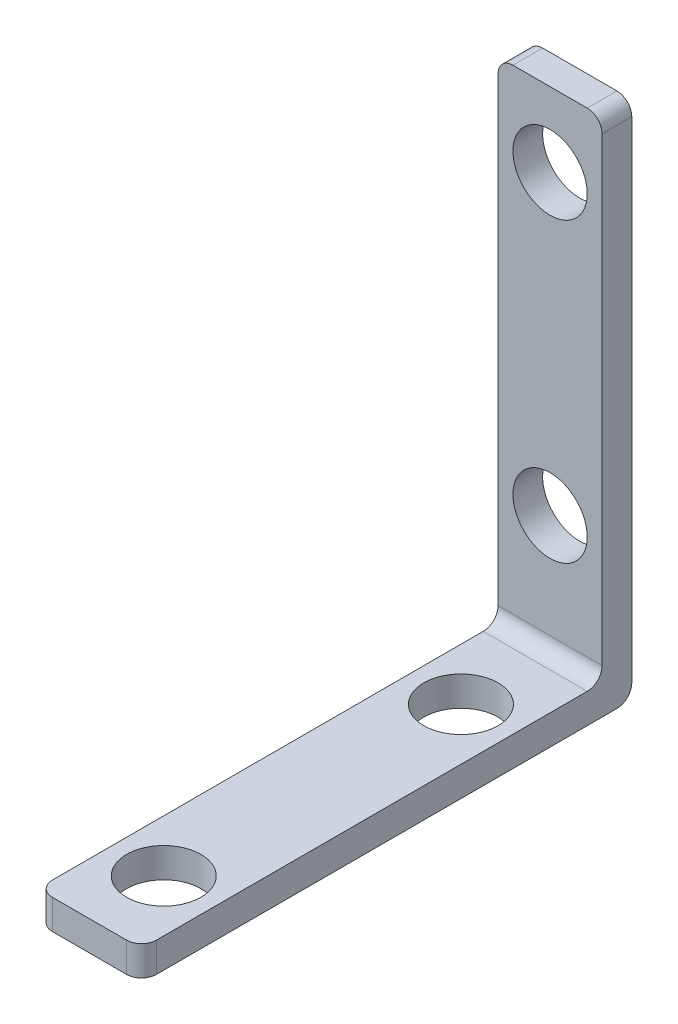
ISO-10303-21;
HEADER;
FILE_DESCRIPTION(('STEP AP214'),'2;1');
FILE_NAME('part.step','',(''),(''),'','','');
FILE_SCHEMA(('AUTOMOTIVE_DESIGN { 1 0 10303 214 1 1 1 1 }'));
ENDSEC;
DATA;
#1=APPLICATION_CONTEXT('core data for automotive mechanical design processes');
#2=APPLICATION_PROTOCOL_DEFINITION('international standard','automotive_design',2000,#1);
#3=PRODUCT_CONTEXT('',#1,'mechanical');
#4=PRODUCT('Part','Part','',(#3));
#5=PRODUCT_RELATED_PRODUCT_CATEGORY('part','',(#4));
#6=PRODUCT_DEFINITION_FORMATION('','',#4);
#7=PRODUCT_DEFINITION_CONTEXT('part definition',#1,'design');
#8=PRODUCT_DEFINITION('design','',#6,#7);
#9=PRODUCT_DEFINITION_SHAPE('','',#8);
#10=(LENGTH_UNIT() NAMED_UNIT(*) SI_UNIT(.MILLI.,.METRE.));
#11=(NAMED_UNIT(*) PLANE_ANGLE_UNIT() SI_UNIT($,.RADIAN.));
#12=(NAMED_UNIT(*) SI_UNIT($,.STERADIAN.) SOLID_ANGLE_UNIT());
#13=UNCERTAINTY_MEASURE_WITH_UNIT(LENGTH_MEASURE(1.E-05),#10,'distance_accuracy_value','');
#14=(GEOMETRIC_REPRESENTATION_CONTEXT(3) GLOBAL_UNCERTAINTY_ASSIGNED_CONTEXT((#13)) GLOBAL_UNIT_ASSIGNED_CONTEXT((#10,
#11,#12)) REPRESENTATION_CONTEXT('',''));
#15=CARTESIAN_POINT('',(0.,0.,0.));
#16=DIRECTION('',(0.,0.,1.));
#17=DIRECTION('',(1.,0.,0.));
#18=AXIS2_PLACEMENT_3D('',#15,#16,#17);
#19=CARTESIAN_POINT('',(7.,0.,2.));
#20=DIRECTION('',(-1.,0.,0.));
#21=DIRECTION('',(0.,0.,1.));
#22=AXIS2_PLACEMENT_3D('',#19,#20,#21);
#23=PLANE('',#22);
#24=DIRECTION('',(0.,1.,0.));
#25=VECTOR('',#24,1.);
#26=CARTESIAN_POINT('',(7.,0.,0.));
#27=LINE('',#26,#25);
#28=CARTESIAN_POINT('',(7.,1.,0.));
#29=VERTEX_POINT('',#28);
#30=CARTESIAN_POINT('',(7.,34.,0.));
#31=VERTEX_POINT('',#30);
#32=EDGE_CURVE('E146',#29,#31,#27,.T.);
#33=ORIENTED_EDGE('',*,*,#32,.T.);
#34=DIRECTION('',(0.,0.,-1.));
#35=VECTOR('',#34,1.);
#36=CARTESIAN_POINT('',(7.,34.,2.));
#37=LINE('',#36,#35);
#38=CARTESIAN_POINT('',(7.,34.,2.));
#39=VERTEX_POINT('',#38);
#40=EDGE_CURVE('E167',#31,#39,#37,.F.);
#41=ORIENTED_EDGE('',*,*,#40,.T.);
#42=DIRECTION('',(0.,1.,0.));
#43=VECTOR('',#42,1.);
#44=CARTESIAN_POINT('',(7.,0.,2.));
#45=LINE('',#44,#43);
#46=CARTESIAN_POINT('',(7.,3.,2.));
#47=VERTEX_POINT('',#46);
#48=EDGE_CURVE('E215',#47,#39,#45,.T.);
#49=ORIENTED_EDGE('',*,*,#48,.F.);
#50=CARTESIAN_POINT('',(7.,3.,3.));
#51=DIRECTION('',(-1.,0.,0.));
#52=DIRECTION('',(0.,0.,1.));
#53=AXIS2_PLACEMENT_3D('',#50,#51,#52);
#54=CIRCLE('',#53,1.);
#55=CARTESIAN_POINT('',(7.,2.,3.));
#56=VERTEX_POINT('',#55);
#57=EDGE_CURVE('E11',#47,#56,#54,.T.);
#58=ORIENTED_EDGE('',*,*,#57,.T.);
#59=DIRECTION('',(0.,0.,-1.));
#60=VECTOR('',#59,1.);
#61=CARTESIAN_POINT('',(7.,2.,33.));
#62=LINE('',#61,#60);
#63=CARTESIAN_POINT('',(7.,2.,32.));
#64=VERTEX_POINT('',#63);
#65=EDGE_CURVE('E214',#64,#56,#62,.T.);
#66=ORIENTED_EDGE('',*,*,#65,.F.);
#67=DIRECTION('',(0.,1.,0.));
#68=VECTOR('',#67,1.);
#69=CARTESIAN_POINT('',(7.,0.,32.));
#70=LINE('',#69,#68);
#71=CARTESIAN_POINT('',(7.,0.,32.));
#72=VERTEX_POINT('',#71);
#73=EDGE_CURVE('E165',#64,#72,#70,.F.);
#74=ORIENTED_EDGE('',*,*,#73,.T.);
#75=DIRECTION('',(0.,0.,-1.));
#76=VECTOR('',#75,1.);
#77=CARTESIAN_POINT('',(7.,0.,33.));
#78=LINE('',#77,#76);
#79=CARTESIAN_POINT('',(7.,0.,1.));
#80=VERTEX_POINT('',#79);
#81=EDGE_CURVE('E217',#72,#80,#78,.T.);
#82=ORIENTED_EDGE('',*,*,#81,.T.);
#83=CARTESIAN_POINT('',(7.,1.,1.));
#84=DIRECTION('',(-1.,0.,0.));
#85=DIRECTION('',(0.,0.,1.));
#86=AXIS2_PLACEMENT_3D('',#83,#84,#85);
#87=CIRCLE('',#86,1.);
#88=EDGE_CURVE('E163',#80,#29,#87,.F.);
#89=ORIENTED_EDGE('',*,*,#88,.T.);
#90=EDGE_LOOP('',(#33,#41,#49,#58,#66,#74,#82,#89));
#91=FACE_BOUND('',#90,.T.);
#92=ADVANCED_FACE('F35',(#91),#23,.F.);
#93=CARTESIAN_POINT('',(0.,35.,2.));
#94=DIRECTION('',(0.,1.,0.));
#95=DIRECTION('',(0.,0.,1.));
#96=AXIS2_PLACEMENT_3D('',#93,#94,#95);
#97=PLANE('',#96);
#98=DIRECTION('',(1.,0.,0.));
#99=VECTOR('',#98,1.);
#100=CARTESIAN_POINT('',(0.,35.,2.));
#101=LINE('',#100,#99);
#102=CARTESIAN_POINT('',(1.,35.,2.));
#103=VERTEX_POINT('',#102);
#104=CARTESIAN_POINT('',(6.,35.,2.));
#105=VERTEX_POINT('',#104);
#106=EDGE_CURVE('E155',#103,#105,#101,.T.);
#107=ORIENTED_EDGE('',*,*,#106,.T.);
#108=DIRECTION('',(0.,0.,-1.));
#109=VECTOR('',#108,1.);
#110=CARTESIAN_POINT('',(6.,35.,0.));
#111=LINE('',#110,#109);
#112=CARTESIAN_POINT('',(6.,35.,0.));
#113=VERTEX_POINT('',#112);
#114=EDGE_CURVE('E145',#105,#113,#111,.T.);
#115=ORIENTED_EDGE('',*,*,#114,.T.);
#116=DIRECTION('',(1.,0.,0.));
#117=VECTOR('',#116,1.);
#118=CARTESIAN_POINT('',(0.,35.,0.));
#119=LINE('',#118,#117);
#120=CARTESIAN_POINT('',(1.,35.,0.));
#121=VERTEX_POINT('',#120);
#122=EDGE_CURVE('E128',#121,#113,#119,.T.);
#123=ORIENTED_EDGE('',*,*,#122,.F.);
#124=DIRECTION('',(0.,0.,-1.));
#125=VECTOR('',#124,1.);
#126=CARTESIAN_POINT('',(1.,35.,2.));
#127=LINE('',#126,#125);
#128=EDGE_CURVE('E142',#121,#103,#127,.F.);
#129=ORIENTED_EDGE('',*,*,#128,.T.);
#130=EDGE_LOOP('',(#107,#115,#123,#129));
#131=FACE_BOUND('',#130,.T.);
#132=ADVANCED_FACE('F141',(#131),#97,.T.);
#133=CARTESIAN_POINT('',(3.5,30.,2.));
#134=DIRECTION('',(0.,0.,-1.));
#135=DIRECTION('',(-1.,0.,0.));
#136=AXIS2_PLACEMENT_3D('',#133,#134,#135);
#137=CYLINDRICAL_SURFACE('',#136,2.5);
#138=CARTESIAN_POINT('',(3.5,30.,2.));
#139=DIRECTION('',(0.,0.,1.));
#140=DIRECTION('',(1.,0.,0.));
#141=AXIS2_PLACEMENT_3D('',#138,#139,#140);
#142=CIRCLE('',#141,2.5);
#143=CARTESIAN_POINT('',(6.,30.,2.));
#144=VERTEX_POINT('',#143);
#145=EDGE_CURVE('E229',#144,#144,#142,.T.);
#146=ORIENTED_EDGE('',*,*,#145,.T.);
#147=EDGE_LOOP('',(#146));
#148=FACE_BOUND('',#147,.T.);
#149=CARTESIAN_POINT('',(3.5,30.,0.));
#150=DIRECTION('',(0.,0.,1.));
#151=DIRECTION('',(1.,0.,0.));
#152=AXIS2_PLACEMENT_3D('',#149,#150,#151);
#153=CIRCLE('',#152,2.5);
#154=CARTESIAN_POINT('',(6.,30.,0.));
#155=VERTEX_POINT('',#154);
#156=EDGE_CURVE('E236',#155,#155,#153,.T.);
#157=ORIENTED_EDGE('',*,*,#156,.F.);
#158=EDGE_LOOP('',(#157));
#159=FACE_BOUND('',#158,.T.);
#160=ADVANCED_FACE('F293',(#148,#159),#137,.F.);
#161=CARTESIAN_POINT('',(3.5,10.,2.));
#162=DIRECTION('',(0.,0.,-1.));
#163=DIRECTION('',(-1.,0.,0.));
#164=AXIS2_PLACEMENT_3D('',#161,#162,#163);
#165=CYLINDRICAL_SURFACE('',#164,2.5);
#166=CARTESIAN_POINT('',(3.5,10.,2.));
#167=DIRECTION('',(0.,0.,1.));
#168=DIRECTION('',(1.,0.,0.));
#169=AXIS2_PLACEMENT_3D('',#166,#167,#168);
#170=CIRCLE('',#169,2.5);
#171=CARTESIAN_POINT('',(6.,10.,2.));
#172=VERTEX_POINT('',#171);
#173=EDGE_CURVE('E226',#172,#172,#170,.T.);
#174=ORIENTED_EDGE('',*,*,#173,.T.);
#175=EDGE_LOOP('',(#174));
#176=FACE_BOUND('',#175,.T.);
#177=CARTESIAN_POINT('',(3.5,10.,0.));
#178=DIRECTION('',(0.,0.,1.));
#179=DIRECTION('',(1.,0.,0.));
#180=AXIS2_PLACEMENT_3D('',#177,#178,#179);
#181=CIRCLE('',#180,2.5);
#182=CARTESIAN_POINT('',(6.,10.,0.));
#183=VERTEX_POINT('',#182);
#184=EDGE_CURVE('E220',#183,#183,#181,.T.);
#185=ORIENTED_EDGE('',*,*,#184,.F.);
#186=EDGE_LOOP('',(#185));
#187=FACE_BOUND('',#186,.T.);
#188=ADVANCED_FACE('F298',(#176,#187),#165,.F.);
#189=CARTESIAN_POINT('',(0.,0.,2.));
#190=DIRECTION('',(-1.,0.,0.));
#191=DIRECTION('',(0.,0.,1.));
#192=AXIS2_PLACEMENT_3D('',#189,#190,#191);
#193=PLANE('',#192);
#194=DIRECTION('',(0.,1.,0.));
#195=VECTOR('',#194,1.);
#196=CARTESIAN_POINT('',(0.,0.,2.));
#197=LINE('',#196,#195);
#198=CARTESIAN_POINT('',(0.,3.,2.));
#199=VERTEX_POINT('',#198);
#200=CARTESIAN_POINT('',(0.,34.,2.));
#201=VERTEX_POINT('',#200);
#202=EDGE_CURVE('E151',#199,#201,#197,.T.);
#203=ORIENTED_EDGE('',*,*,#202,.T.);
#204=DIRECTION('',(0.,0.,-1.));
#205=VECTOR('',#204,1.);
#206=CARTESIAN_POINT('',(0.,34.,2.));
#207=LINE('',#206,#205);
#208=CARTESIAN_POINT('',(0.,34.,0.));
#209=VERTEX_POINT('',#208);
#210=EDGE_CURVE('E179',#201,#209,#207,.T.);
#211=ORIENTED_EDGE('',*,*,#210,.T.);
#212=DIRECTION('',(0.,1.,0.));
#213=VECTOR('',#212,1.);
#214=CARTESIAN_POINT('',(0.,0.,0.));
#215=LINE('',#214,#213);
#216=CARTESIAN_POINT('',(0.,1.,0.));
#217=VERTEX_POINT('',#216);
#218=EDGE_CURVE('E130',#217,#209,#215,.T.);
#219=ORIENTED_EDGE('',*,*,#218,.F.);
#220=CARTESIAN_POINT('',(0.,1.,1.));
#221=DIRECTION('',(-1.,0.,0.));
#222=DIRECTION('',(0.,0.,1.));
#223=AXIS2_PLACEMENT_3D('',#220,#221,#222);
#224=CIRCLE('',#223,1.);
#225=CARTESIAN_POINT('',(0.,0.,1.));
#226=VERTEX_POINT('',#225);
#227=EDGE_CURVE('E174',#217,#226,#224,.T.);
#228=ORIENTED_EDGE('',*,*,#227,.T.);
#229=DIRECTION('',(0.,0.,-1.));
#230=VECTOR('',#229,1.);
#231=CARTESIAN_POINT('',(0.,0.,33.));
#232=LINE('',#231,#230);
#233=CARTESIAN_POINT('',(0.,0.,32.));
#234=VERTEX_POINT('',#233);
#235=EDGE_CURVE('E222',#234,#226,#232,.T.);
#236=ORIENTED_EDGE('',*,*,#235,.F.);
#237=DIRECTION('',(0.,1.,0.));
#238=VECTOR('',#237,1.);
#239=CARTESIAN_POINT('',(0.,0.,32.));
#240=LINE('',#239,#238);
#241=CARTESIAN_POINT('',(0.,2.,32.));
#242=VERTEX_POINT('',#241);
#243=EDGE_CURVE('E176',#234,#242,#240,.T.);
#244=ORIENTED_EDGE('',*,*,#243,.T.);
#245=DIRECTION('',(0.,0.,-1.));
#246=VECTOR('',#245,1.);
#247=CARTESIAN_POINT('',(0.,2.,33.));
#248=LINE('',#247,#246);
#249=CARTESIAN_POINT('',(0.,2.,3.));
#250=VERTEX_POINT('',#249);
#251=EDGE_CURVE('E200',#242,#250,#248,.T.);
#252=ORIENTED_EDGE('',*,*,#251,.T.);
#253=CARTESIAN_POINT('',(0.,3.,3.));
#254=DIRECTION('',(-1.,0.,0.));
#255=DIRECTION('',(0.,0.,1.));
#256=AXIS2_PLACEMENT_3D('',#253,#254,#255);
#257=CIRCLE('',#256,1.);
#258=EDGE_CURVE('E43',#250,#199,#257,.F.);
#259=ORIENTED_EDGE('',*,*,#258,.T.);
#260=EDGE_LOOP('',(#203,#211,#219,#228,#236,#244,#252,#259));
#261=FACE_BOUND('',#260,.T.);
#262=ADVANCED_FACE('F199',(#261),#193,.T.);
#263=CARTESIAN_POINT('',(0.,0.,2.));
#264=DIRECTION('',(0.,0.,1.));
#265=DIRECTION('',(1.,0.,0.));
#266=AXIS2_PLACEMENT_3D('',#263,#264,#265);
#267=PLANE('',#266);
#268=ORIENTED_EDGE('',*,*,#173,.F.);
#269=EDGE_LOOP('',(#268));
#270=FACE_BOUND('',#269,.T.);
#271=ORIENTED_EDGE('',*,*,#145,.F.);
#272=EDGE_LOOP('',(#271));
#273=FACE_BOUND('',#272,.T.);
#274=ORIENTED_EDGE('',*,*,#48,.T.);
#275=CARTESIAN_POINT('',(6.,34.,2.));
#276=DIRECTION('',(0.,0.,1.));
#277=DIRECTION('',(1.,0.,0.));
#278=AXIS2_PLACEMENT_3D('',#275,#276,#277);
#279=CIRCLE('',#278,1.);
#280=EDGE_CURVE('E172',#39,#105,#279,.T.);
#281=ORIENTED_EDGE('',*,*,#280,.T.);
#282=ORIENTED_EDGE('',*,*,#106,.F.);
#283=CARTESIAN_POINT('',(1.,34.,2.));
#284=DIRECTION('',(0.,0.,1.));
#285=DIRECTION('',(1.,0.,0.));
#286=AXIS2_PLACEMENT_3D('',#283,#284,#285);
#287=CIRCLE('',#286,1.);
#288=EDGE_CURVE('E150',#103,#201,#287,.T.);
#289=ORIENTED_EDGE('',*,*,#288,.T.);
#290=ORIENTED_EDGE('',*,*,#202,.F.);
#291=DIRECTION('',(-1.,0.,0.));
#292=VECTOR('',#291,1.);
#293=CARTESIAN_POINT('',(0.,3.,2.));
#294=LINE('',#293,#292);
#295=EDGE_CURVE('E169',#199,#47,#294,.F.);
#296=ORIENTED_EDGE('',*,*,#295,.T.);
#297=EDGE_LOOP('',(#274,#281,#282,#289,#290,#296));
#298=FACE_BOUND('',#297,.T.);
#299=ADVANCED_FACE('F206',(#270,#273,#298),#267,.T.);
#300=CARTESIAN_POINT('',(0.,0.,0.));
#301=DIRECTION('',(0.,0.,1.));
#302=DIRECTION('',(1.,0.,0.));
#303=AXIS2_PLACEMENT_3D('',#300,#301,#302);
#304=PLANE('',#303);
#305=ORIENTED_EDGE('',*,*,#184,.T.);
#306=EDGE_LOOP('',(#305));
#307=FACE_BOUND('',#306,.T.);
#308=ORIENTED_EDGE('',*,*,#156,.T.);
#309=EDGE_LOOP('',(#308));
#310=FACE_BOUND('',#309,.T.);
#311=ORIENTED_EDGE('',*,*,#122,.T.);
#312=CARTESIAN_POINT('',(6.,34.,0.));
#313=DIRECTION('',(0.,0.,1.));
#314=DIRECTION('',(1.,0.,0.));
#315=AXIS2_PLACEMENT_3D('',#312,#313,#314);
#316=CIRCLE('',#315,1.);
#317=EDGE_CURVE('E135',#113,#31,#316,.F.);
#318=ORIENTED_EDGE('',*,*,#317,.T.);
#319=ORIENTED_EDGE('',*,*,#32,.F.);
#320=DIRECTION('',(1.,0.,0.));
#321=VECTOR('',#320,1.);
#322=CARTESIAN_POINT('',(0.,1.,0.));
#323=LINE('',#322,#321);
#324=EDGE_CURVE('E136',#29,#217,#323,.F.);
#325=ORIENTED_EDGE('',*,*,#324,.T.);
#326=ORIENTED_EDGE('',*,*,#218,.T.);
#327=CARTESIAN_POINT('',(1.,34.,0.));
#328=DIRECTION('',(0.,0.,1.));
#329=DIRECTION('',(1.,0.,0.));
#330=AXIS2_PLACEMENT_3D('',#327,#328,#329);
#331=CIRCLE('',#330,1.);
#332=EDGE_CURVE('E125',#209,#121,#331,.F.);
#333=ORIENTED_EDGE('',*,*,#332,.T.);
#334=EDGE_LOOP('',(#311,#318,#319,#325,#326,#333));
#335=FACE_BOUND('',#334,.T.);
#336=ADVANCED_FACE('F127',(#307,#310,#335),#304,.F.);
#337=CARTESIAN_POINT('',(0.,2.,33.));
#338=DIRECTION('',(0.,-1.,0.));
#339=DIRECTION('',(1.,0.,0.));
#340=AXIS2_PLACEMENT_3D('',#337,#338,#339);
#341=PLANE('',#340);
#342=CARTESIAN_POINT('',(3.5,2.,28.));
#343=DIRECTION('',(0.,-1.,0.));
#344=DIRECTION('',(1.,0.,0.));
#345=AXIS2_PLACEMENT_3D('',#342,#343,#344);
#346=CIRCLE('',#345,2.5);
#347=CARTESIAN_POINT('',(6.,2.,28.));
#348=VERTEX_POINT('',#347);
#349=EDGE_CURVE('E250',#348,#348,#346,.T.);
#350=ORIENTED_EDGE('',*,*,#349,.T.);
#351=EDGE_LOOP('',(#350));
#352=FACE_BOUND('',#351,.T.);
#353=CARTESIAN_POINT('',(3.5,2.,8.));
#354=DIRECTION('',(0.,-1.,0.));
#355=DIRECTION('',(1.,0.,0.));
#356=AXIS2_PLACEMENT_3D('',#353,#354,#355);
#357=CIRCLE('',#356,2.5);
#358=CARTESIAN_POINT('',(6.,2.,8.));
#359=VERTEX_POINT('',#358);
#360=EDGE_CURVE('E242',#359,#359,#357,.T.);
#361=ORIENTED_EDGE('',*,*,#360,.T.);
#362=EDGE_LOOP('',(#361));
#363=FACE_BOUND('',#362,.T.);
#364=DIRECTION('',(-1.,0.,0.));
#365=VECTOR('',#364,1.);
#366=CARTESIAN_POINT('',(0.,2.,33.));
#367=LINE('',#366,#365);
#368=CARTESIAN_POINT('',(6.,2.,33.));
#369=VERTEX_POINT('',#368);
#370=CARTESIAN_POINT('',(1.,2.,33.));
#371=VERTEX_POINT('',#370);
#372=EDGE_CURVE('E257',#369,#371,#367,.T.);
#373=ORIENTED_EDGE('',*,*,#372,.F.);
#374=CARTESIAN_POINT('',(6.,2.,32.));
#375=DIRECTION('',(0.,-1.,0.));
#376=DIRECTION('',(1.,0.,0.));
#377=AXIS2_PLACEMENT_3D('',#374,#375,#376);
#378=CIRCLE('',#377,1.);
#379=EDGE_CURVE('E58',#369,#64,#378,.F.);
#380=ORIENTED_EDGE('',*,*,#379,.T.);
#381=ORIENTED_EDGE('',*,*,#65,.T.);
#382=DIRECTION('',(-1.,0.,0.));
#383=VECTOR('',#382,1.);
#384=CARTESIAN_POINT('',(0.,2.,3.));
#385=LINE('',#384,#383);
#386=EDGE_CURVE('E185',#56,#250,#385,.T.);
#387=ORIENTED_EDGE('',*,*,#386,.T.);
#388=ORIENTED_EDGE('',*,*,#251,.F.);
#389=CARTESIAN_POINT('',(1.,2.,32.));
#390=DIRECTION('',(0.,-1.,0.));
#391=DIRECTION('',(1.,0.,0.));
#392=AXIS2_PLACEMENT_3D('',#389,#390,#391);
#393=CIRCLE('',#392,1.);
#394=EDGE_CURVE('E50',#242,#371,#393,.F.);
#395=ORIENTED_EDGE('',*,*,#394,.T.);
#396=EDGE_LOOP('',(#373,#380,#381,#387,#388,#395));
#397=FACE_BOUND('',#396,.T.);
#398=ADVANCED_FACE('F216',(#352,#363,#397),#341,.F.);
#399=CARTESIAN_POINT('',(0.,0.,33.));
#400=DIRECTION('',(0.,1.,0.));
#401=DIRECTION('',(0.,0.,1.));
#402=AXIS2_PLACEMENT_3D('',#399,#400,#401);
#403=PLANE('',#402);
#404=CARTESIAN_POINT('',(3.5,0.,28.));
#405=DIRECTION('',(0.,1.,0.));
#406=DIRECTION('',(0.,0.,1.));
#407=AXIS2_PLACEMENT_3D('',#404,#405,#406);
#408=CIRCLE('',#407,2.5);
#409=CARTESIAN_POINT('',(3.5,0.,30.5));
#410=VERTEX_POINT('',#409);
#411=EDGE_CURVE('E158',#410,#410,#408,.T.);
#412=ORIENTED_EDGE('',*,*,#411,.T.);
#413=EDGE_LOOP('',(#412));
#414=FACE_BOUND('',#413,.T.);
#415=CARTESIAN_POINT('',(3.5,0.,8.));
#416=DIRECTION('',(0.,1.,0.));
#417=DIRECTION('',(0.,0.,1.));
#418=AXIS2_PLACEMENT_3D('',#415,#416,#417);
#419=CIRCLE('',#418,2.5);
#420=CARTESIAN_POINT('',(3.5,0.,10.5));
#421=VERTEX_POINT('',#420);
#422=EDGE_CURVE('E240',#421,#421,#419,.T.);
#423=ORIENTED_EDGE('',*,*,#422,.T.);
#424=EDGE_LOOP('',(#423));
#425=FACE_BOUND('',#424,.T.);
#426=ORIENTED_EDGE('',*,*,#81,.F.);
#427=CARTESIAN_POINT('',(6.,0.,32.));
#428=DIRECTION('',(0.,1.,0.));
#429=DIRECTION('',(0.,0.,1.));
#430=AXIS2_PLACEMENT_3D('',#427,#428,#429);
#431=CIRCLE('',#430,1.);
#432=CARTESIAN_POINT('',(6.,0.,33.));
#433=VERTEX_POINT('',#432);
#434=EDGE_CURVE('E195',#72,#433,#431,.F.);
#435=ORIENTED_EDGE('',*,*,#434,.T.);
#436=DIRECTION('',(1.,0.,0.));
#437=VECTOR('',#436,1.);
#438=CARTESIAN_POINT('',(0.,0.,33.));
#439=LINE('',#438,#437);
#440=CARTESIAN_POINT('',(1.,0.,33.));
#441=VERTEX_POINT('',#440);
#442=EDGE_CURVE('E254',#441,#433,#439,.T.);
#443=ORIENTED_EDGE('',*,*,#442,.F.);
#444=CARTESIAN_POINT('',(1.,0.,32.));
#445=DIRECTION('',(0.,1.,0.));
#446=DIRECTION('',(0.,0.,1.));
#447=AXIS2_PLACEMENT_3D('',#444,#445,#446);
#448=CIRCLE('',#447,1.);
#449=EDGE_CURVE('E193',#441,#234,#448,.F.);
#450=ORIENTED_EDGE('',*,*,#449,.T.);
#451=ORIENTED_EDGE('',*,*,#235,.T.);
#452=DIRECTION('',(1.,0.,0.));
#453=VECTOR('',#452,1.);
#454=CARTESIAN_POINT('',(0.,0.,1.));
#455=LINE('',#454,#453);
#456=EDGE_CURVE('E190',#226,#80,#455,.T.);
#457=ORIENTED_EDGE('',*,*,#456,.T.);
#458=EDGE_LOOP('',(#426,#435,#443,#450,#451,#457));
#459=FACE_BOUND('',#458,.T.);
#460=ADVANCED_FACE('F263',(#414,#425,#459),#403,.F.);
#461=CARTESIAN_POINT('',(0.,0.,33.));
#462=DIRECTION('',(0.,0.,1.));
#463=DIRECTION('',(1.,0.,0.));
#464=AXIS2_PLACEMENT_3D('',#461,#462,#463);
#465=PLANE('',#464);
#466=ORIENTED_EDGE('',*,*,#442,.T.);
#467=DIRECTION('',(0.,1.,0.));
#468=VECTOR('',#467,1.);
#469=CARTESIAN_POINT('',(6.,2.,33.));
#470=LINE('',#469,#468);
#471=EDGE_CURVE('E183',#433,#369,#470,.T.);
#472=ORIENTED_EDGE('',*,*,#471,.T.);
#473=ORIENTED_EDGE('',*,*,#372,.T.);
#474=DIRECTION('',(0.,1.,0.));
#475=VECTOR('',#474,1.);
#476=CARTESIAN_POINT('',(1.,0.,33.));
#477=LINE('',#476,#475);
#478=EDGE_CURVE('E181',#371,#441,#477,.F.);
#479=ORIENTED_EDGE('',*,*,#478,.T.);
#480=EDGE_LOOP('',(#466,#472,#473,#479));
#481=FACE_BOUND('',#480,.T.);
#482=ADVANCED_FACE('F324',(#481),#465,.T.);
#483=CARTESIAN_POINT('',(3.5,35.,8.));
#484=DIRECTION('',(0.,-1.,0.));
#485=DIRECTION('',(0.,0.,-1.));
#486=AXIS2_PLACEMENT_3D('',#483,#484,#485);
#487=CYLINDRICAL_SURFACE('',#486,2.5);
#488=ORIENTED_EDGE('',*,*,#422,.F.);
#489=EDGE_LOOP('',(#488));
#490=FACE_BOUND('',#489,.T.);
#491=ORIENTED_EDGE('',*,*,#360,.F.);
#492=EDGE_LOOP('',(#491));
#493=FACE_BOUND('',#492,.T.);
#494=ADVANCED_FACE('F284',(#490,#493),#487,.F.);
#495=CARTESIAN_POINT('',(3.5,35.,28.));
#496=DIRECTION('',(0.,-1.,0.));
#497=DIRECTION('',(0.,0.,-1.));
#498=AXIS2_PLACEMENT_3D('',#495,#496,#497);
#499=CYLINDRICAL_SURFACE('',#498,2.5);
#500=ORIENTED_EDGE('',*,*,#411,.F.);
#501=EDGE_LOOP('',(#500));
#502=FACE_BOUND('',#501,.T.);
#503=ORIENTED_EDGE('',*,*,#349,.F.);
#504=EDGE_LOOP('',(#503));
#505=FACE_BOUND('',#504,.T.);
#506=ADVANCED_FACE('F276',(#502,#505),#499,.F.);
#507=CARTESIAN_POINT('',(6.,34.,2.));
#508=DIRECTION('',(0.,0.,1.));
#509=DIRECTION('',(1.,0.,0.));
#510=AXIS2_PLACEMENT_3D('',#507,#508,#509);
#511=CYLINDRICAL_SURFACE('',#510,1.);
#512=ORIENTED_EDGE('',*,*,#280,.F.);
#513=ORIENTED_EDGE('',*,*,#40,.F.);
#514=ORIENTED_EDGE('',*,*,#317,.F.);
#515=ORIENTED_EDGE('',*,*,#114,.F.);
#516=EDGE_LOOP('',(#512,#513,#514,#515));
#517=FACE_BOUND('',#516,.T.);
#518=ADVANCED_FACE('F274',(#517),#511,.T.);
#519=CARTESIAN_POINT('',(1.,34.,2.));
#520=DIRECTION('',(0.,0.,-1.));
#521=DIRECTION('',(-1.,0.,0.));
#522=AXIS2_PLACEMENT_3D('',#519,#520,#521);
#523=CYLINDRICAL_SURFACE('',#522,1.);
#524=ORIENTED_EDGE('',*,*,#288,.F.);
#525=ORIENTED_EDGE('',*,*,#128,.F.);
#526=ORIENTED_EDGE('',*,*,#332,.F.);
#527=ORIENTED_EDGE('',*,*,#210,.F.);
#528=EDGE_LOOP('',(#524,#525,#526,#527));
#529=FACE_BOUND('',#528,.T.);
#530=ADVANCED_FACE('F149',(#529),#523,.T.);
#531=CARTESIAN_POINT('',(6.,0.,32.));
#532=DIRECTION('',(0.,-1.,0.));
#533=DIRECTION('',(0.,0.,-1.));
#534=AXIS2_PLACEMENT_3D('',#531,#532,#533);
#535=CYLINDRICAL_SURFACE('',#534,1.);
#536=ORIENTED_EDGE('',*,*,#434,.F.);
#537=ORIENTED_EDGE('',*,*,#73,.F.);
#538=ORIENTED_EDGE('',*,*,#379,.F.);
#539=ORIENTED_EDGE('',*,*,#471,.F.);
#540=EDGE_LOOP('',(#536,#537,#538,#539));
#541=FACE_BOUND('',#540,.T.);
#542=ADVANCED_FACE('F282',(#541),#535,.T.);
#543=CARTESIAN_POINT('',(1.,0.,32.));
#544=DIRECTION('',(0.,1.,0.));
#545=DIRECTION('',(0.,0.,1.));
#546=AXIS2_PLACEMENT_3D('',#543,#544,#545);
#547=CYLINDRICAL_SURFACE('',#546,1.);
#548=ORIENTED_EDGE('',*,*,#449,.F.);
#549=ORIENTED_EDGE('',*,*,#478,.F.);
#550=ORIENTED_EDGE('',*,*,#394,.F.);
#551=ORIENTED_EDGE('',*,*,#243,.F.);
#552=EDGE_LOOP('',(#548,#549,#550,#551));
#553=FACE_BOUND('',#552,.T.);
#554=ADVANCED_FACE('F406',(#553),#547,.T.);
#555=CARTESIAN_POINT('',(0.,3.,3.));
#556=DIRECTION('',(-1.,0.,0.));
#557=DIRECTION('',(0.,-1.,0.));
#558=AXIS2_PLACEMENT_3D('',#555,#556,#557);
#559=CYLINDRICAL_SURFACE('',#558,1.);
#560=ORIENTED_EDGE('',*,*,#57,.F.);
#561=ORIENTED_EDGE('',*,*,#295,.F.);
#562=ORIENTED_EDGE('',*,*,#258,.F.);
#563=ORIENTED_EDGE('',*,*,#386,.F.);
#564=EDGE_LOOP('',(#560,#561,#562,#563));
#565=FACE_BOUND('',#564,.T.);
#566=ADVANCED_FACE('F209',(#565),#559,.F.);
#567=CARTESIAN_POINT('',(0.,1.,1.));
#568=DIRECTION('',(1.,0.,0.));
#569=DIRECTION('',(0.,0.,-1.));
#570=AXIS2_PLACEMENT_3D('',#567,#568,#569);
#571=CYLINDRICAL_SURFACE('',#570,1.);
#572=ORIENTED_EDGE('',*,*,#227,.F.);
#573=ORIENTED_EDGE('',*,*,#324,.F.);
#574=ORIENTED_EDGE('',*,*,#88,.F.);
#575=ORIENTED_EDGE('',*,*,#456,.F.);
#576=EDGE_LOOP('',(#572,#573,#574,#575));
#577=FACE_BOUND('',#576,.T.);
#578=ADVANCED_FACE('F37',(#577),#571,.T.);
#579=CLOSED_SHELL('',(#92,#132,#160,#188,#262,#299,#336,#398,#460,#482,#494,#506,#518,#530,#542,
#554,#566,#578));
#580=MANIFOLD_SOLID_BREP('B2',#579);
#581=ADVANCED_BREP_SHAPE_REPRESENTATION('',(#18,#580),#14);
#582=SHAPE_DEFINITION_REPRESENTATION(#9,#581);
ENDSEC;
END-ISO-10303-21;
